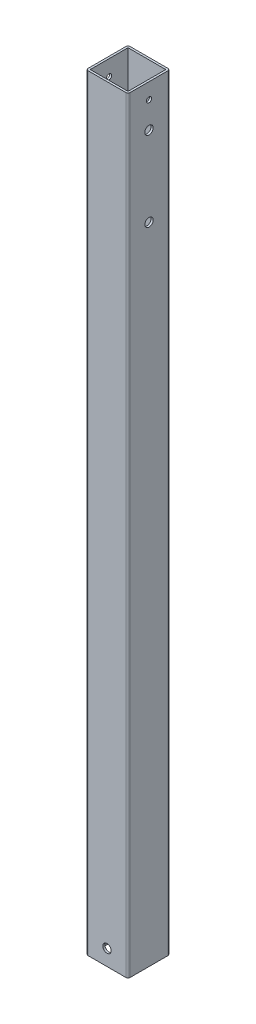
ISO-10303-21;
HEADER;
FILE_DESCRIPTION(('STEP AP214'),'2;1');
FILE_NAME('part.step','',(''),(''),'','','');
FILE_SCHEMA(('AUTOMOTIVE_DESIGN { 1 0 10303 214 1 1 1 1 }'));
ENDSEC;
DATA;
#1=APPLICATION_CONTEXT('core data for automotive mechanical design processes');
#2=APPLICATION_PROTOCOL_DEFINITION('international standard','automotive_design',2000,#1);
#3=PRODUCT_CONTEXT('',#1,'mechanical');
#4=PRODUCT('Part','Part','',(#3));
#5=PRODUCT_RELATED_PRODUCT_CATEGORY('part','',(#4));
#6=PRODUCT_DEFINITION_FORMATION('','',#4);
#7=PRODUCT_DEFINITION_CONTEXT('part definition',#1,'design');
#8=PRODUCT_DEFINITION('design','',#6,#7);
#9=PRODUCT_DEFINITION_SHAPE('','',#8);
#10=(LENGTH_UNIT() NAMED_UNIT(*) SI_UNIT(.MILLI.,.METRE.));
#11=(NAMED_UNIT(*) PLANE_ANGLE_UNIT() SI_UNIT($,.RADIAN.));
#12=(NAMED_UNIT(*) SI_UNIT($,.STERADIAN.) SOLID_ANGLE_UNIT());
#13=UNCERTAINTY_MEASURE_WITH_UNIT(LENGTH_MEASURE(1.E-05),#10,'distance_accuracy_value','');
#14=(GEOMETRIC_REPRESENTATION_CONTEXT(3) GLOBAL_UNCERTAINTY_ASSIGNED_CONTEXT((#13)) GLOBAL_UNIT_ASSIGNED_CONTEXT((#10,
#11,#12)) REPRESENTATION_CONTEXT('',''));
#15=CARTESIAN_POINT('',(0.,0.,0.));
#16=DIRECTION('',(0.,0.,1.));
#17=DIRECTION('',(1.,0.,0.));
#18=AXIS2_PLACEMENT_3D('',#15,#16,#17);
#19=CARTESIAN_POINT('',(38.,730.,2.));
#20=DIRECTION('',(0.,1.,0.));
#21=DIRECTION('',(0.,0.,1.));
#22=AXIS2_PLACEMENT_3D('',#19,#20,#21);
#23=PLANE('',#22);
#24=CARTESIAN_POINT('',(38.,730.,2.));
#25=DIRECTION('',(0.,1.,0.));
#26=DIRECTION('',(0.,0.,-1.));
#27=AXIS2_PLACEMENT_3D('',#24,#25,#26);
#28=CIRCLE('',#27,2.);
#29=CARTESIAN_POINT('',(40.,730.,2.00000000000001));
#30=VERTEX_POINT('',#29);
#31=CARTESIAN_POINT('',(38.,730.,0.));
#32=VERTEX_POINT('',#31);
#33=EDGE_CURVE('E198',#30,#32,#28,.T.);
#34=ORIENTED_EDGE('',*,*,#33,.T.);
#35=DIRECTION('',(-1.,0.,0.));
#36=VECTOR('',#35,1.);
#37=CARTESIAN_POINT('',(2.00000000000001,730.,0.));
#38=LINE('',#37,#36);
#39=CARTESIAN_POINT('',(2.00000000000001,730.,0.));
#40=VERTEX_POINT('',#39);
#41=EDGE_CURVE('E201',#32,#40,#38,.T.);
#42=ORIENTED_EDGE('',*,*,#41,.T.);
#43=CARTESIAN_POINT('',(2.,730.,2.));
#44=DIRECTION('',(0.,1.,0.));
#45=DIRECTION('',(0.,0.,1.));
#46=AXIS2_PLACEMENT_3D('',#43,#44,#45);
#47=CIRCLE('',#46,2.);
#48=CARTESIAN_POINT('',(0.,730.,2.00000000000001));
#49=VERTEX_POINT('',#48);
#50=EDGE_CURVE('E204',#40,#49,#47,.T.);
#51=ORIENTED_EDGE('',*,*,#50,.T.);
#52=DIRECTION('',(0.,0.,1.));
#53=VECTOR('',#52,1.);
#54=CARTESIAN_POINT('',(0.,730.,2.00000000000001));
#55=LINE('',#54,#53);
#56=CARTESIAN_POINT('',(0.,730.,38.));
#57=VERTEX_POINT('',#56);
#58=EDGE_CURVE('E206',#49,#57,#55,.T.);
#59=ORIENTED_EDGE('',*,*,#58,.T.);
#60=CARTESIAN_POINT('',(2.,730.,38.));
#61=DIRECTION('',(0.,1.,0.));
#62=DIRECTION('',(0.,0.,1.));
#63=AXIS2_PLACEMENT_3D('',#60,#61,#62);
#64=CIRCLE('',#63,2.);
#65=CARTESIAN_POINT('',(2.,730.,40.));
#66=VERTEX_POINT('',#65);
#67=EDGE_CURVE('E208',#57,#66,#64,.T.);
#68=ORIENTED_EDGE('',*,*,#67,.T.);
#69=DIRECTION('',(1.,0.,0.));
#70=VECTOR('',#69,1.);
#71=CARTESIAN_POINT('',(2.00000000000002,730.,40.));
#72=LINE('',#71,#70);
#73=CARTESIAN_POINT('',(38.,730.,40.));
#74=VERTEX_POINT('',#73);
#75=EDGE_CURVE('E210',#66,#74,#72,.T.);
#76=ORIENTED_EDGE('',*,*,#75,.T.);
#77=CARTESIAN_POINT('',(38.,730.,38.));
#78=DIRECTION('',(0.,1.,0.));
#79=DIRECTION('',(0.,0.,1.));
#80=AXIS2_PLACEMENT_3D('',#77,#78,#79);
#81=CIRCLE('',#80,2.);
#82=CARTESIAN_POINT('',(40.,730.,38.));
#83=VERTEX_POINT('',#82);
#84=EDGE_CURVE('E212',#74,#83,#81,.T.);
#85=ORIENTED_EDGE('',*,*,#84,.T.);
#86=DIRECTION('',(0.,0.,-1.));
#87=VECTOR('',#86,1.);
#88=CARTESIAN_POINT('',(40.,730.,2.00000000000001));
#89=LINE('',#88,#87);
#90=EDGE_CURVE('E214',#83,#30,#89,.T.);
#91=ORIENTED_EDGE('',*,*,#90,.T.);
#92=EDGE_LOOP('',(#34,#42,#51,#59,#68,#76,#85,#91));
#93=FACE_BOUND('',#92,.T.);
#94=DIRECTION('',(-1.,0.,0.));
#95=VECTOR('',#94,1.);
#96=CARTESIAN_POINT('',(38.,730.,2.));
#97=LINE('',#96,#95);
#98=CARTESIAN_POINT('',(38.,730.,2.));
#99=VERTEX_POINT('',#98);
#100=CARTESIAN_POINT('',(2.,730.,2.));
#101=VERTEX_POINT('',#100);
#102=EDGE_CURVE('E168',#99,#101,#97,.T.);
#103=ORIENTED_EDGE('',*,*,#102,.F.);
#104=DIRECTION('',(0.,0.,-1.));
#105=VECTOR('',#104,1.);
#106=CARTESIAN_POINT('',(38.,730.,2.));
#107=LINE('',#106,#105);
#108=CARTESIAN_POINT('',(38.,730.,38.));
#109=VERTEX_POINT('',#108);
#110=EDGE_CURVE('E160',#109,#99,#107,.T.);
#111=ORIENTED_EDGE('',*,*,#110,.F.);
#112=DIRECTION('',(1.,0.,0.));
#113=VECTOR('',#112,1.);
#114=CARTESIAN_POINT('',(38.,730.,38.));
#115=LINE('',#114,#113);
#116=CARTESIAN_POINT('',(2.00000000000001,730.,38.));
#117=VERTEX_POINT('',#116);
#118=EDGE_CURVE('E182',#117,#109,#115,.T.);
#119=ORIENTED_EDGE('',*,*,#118,.F.);
#120=DIRECTION('',(0.,0.,1.));
#121=VECTOR('',#120,1.);
#122=CARTESIAN_POINT('',(2.,730.,2.));
#123=LINE('',#122,#121);
#124=EDGE_CURVE('E180',#101,#117,#123,.T.);
#125=ORIENTED_EDGE('',*,*,#124,.F.);
#126=EDGE_LOOP('',(#103,#111,#119,#125));
#127=FACE_BOUND('',#126,.T.);
#128=ADVANCED_FACE('F69',(#93,#127),#23,.T.);
#129=CARTESIAN_POINT('',(38.,0.,2.));
#130=DIRECTION('',(0.,1.,0.));
#131=DIRECTION('',(0.,0.,1.));
#132=AXIS2_PLACEMENT_3D('',#129,#130,#131);
#133=PLANE('',#132);
#134=CARTESIAN_POINT('',(38.,0.,2.));
#135=DIRECTION('',(0.,1.,0.));
#136=DIRECTION('',(0.,0.,-1.));
#137=AXIS2_PLACEMENT_3D('',#134,#135,#136);
#138=CIRCLE('',#137,2.);
#139=CARTESIAN_POINT('',(40.,0.,2.00000000000001));
#140=VERTEX_POINT('',#139);
#141=CARTESIAN_POINT('',(38.,0.,0.));
#142=VERTEX_POINT('',#141);
#143=EDGE_CURVE('E176',#140,#142,#138,.T.);
#144=ORIENTED_EDGE('',*,*,#143,.F.);
#145=DIRECTION('',(0.,0.,-1.));
#146=VECTOR('',#145,1.);
#147=CARTESIAN_POINT('',(40.,0.,2.00000000000001));
#148=LINE('',#147,#146);
#149=CARTESIAN_POINT('',(40.,0.,38.));
#150=VERTEX_POINT('',#149);
#151=EDGE_CURVE('E202',#150,#140,#148,.T.);
#152=ORIENTED_EDGE('',*,*,#151,.F.);
#153=CARTESIAN_POINT('',(38.,0.,38.));
#154=DIRECTION('',(0.,1.,0.));
#155=DIRECTION('',(0.,0.,1.));
#156=AXIS2_PLACEMENT_3D('',#153,#154,#155);
#157=CIRCLE('',#156,2.);
#158=CARTESIAN_POINT('',(38.,0.,40.));
#159=VERTEX_POINT('',#158);
#160=EDGE_CURVE('E229',#159,#150,#157,.T.);
#161=ORIENTED_EDGE('',*,*,#160,.F.);
#162=DIRECTION('',(1.,0.,0.));
#163=VECTOR('',#162,1.);
#164=CARTESIAN_POINT('',(2.00000000000002,0.,40.));
#165=LINE('',#164,#163);
#166=CARTESIAN_POINT('',(2.,0.,40.));
#167=VERTEX_POINT('',#166);
#168=EDGE_CURVE('E227',#167,#159,#165,.T.);
#169=ORIENTED_EDGE('',*,*,#168,.F.);
#170=CARTESIAN_POINT('',(2.,0.,38.));
#171=DIRECTION('',(0.,1.,0.));
#172=DIRECTION('',(0.,0.,1.));
#173=AXIS2_PLACEMENT_3D('',#170,#171,#172);
#174=CIRCLE('',#173,2.);
#175=CARTESIAN_POINT('',(0.,0.,38.));
#176=VERTEX_POINT('',#175);
#177=EDGE_CURVE('E225',#176,#167,#174,.T.);
#178=ORIENTED_EDGE('',*,*,#177,.F.);
#179=DIRECTION('',(0.,0.,1.));
#180=VECTOR('',#179,1.);
#181=CARTESIAN_POINT('',(0.,0.,2.00000000000001));
#182=LINE('',#181,#180);
#183=CARTESIAN_POINT('',(0.,0.,2.00000000000001));
#184=VERTEX_POINT('',#183);
#185=EDGE_CURVE('E223',#184,#176,#182,.T.);
#186=ORIENTED_EDGE('',*,*,#185,.F.);
#187=CARTESIAN_POINT('',(2.,0.,2.));
#188=DIRECTION('',(0.,1.,0.));
#189=DIRECTION('',(0.,0.,1.));
#190=AXIS2_PLACEMENT_3D('',#187,#188,#189);
#191=CIRCLE('',#190,2.);
#192=CARTESIAN_POINT('',(2.00000000000001,0.,0.));
#193=VERTEX_POINT('',#192);
#194=EDGE_CURVE('E221',#193,#184,#191,.T.);
#195=ORIENTED_EDGE('',*,*,#194,.F.);
#196=DIRECTION('',(-1.,0.,0.));
#197=VECTOR('',#196,1.);
#198=CARTESIAN_POINT('',(2.00000000000001,0.,0.));
#199=LINE('',#198,#197);
#200=EDGE_CURVE('E219',#142,#193,#199,.T.);
#201=ORIENTED_EDGE('',*,*,#200,.F.);
#202=EDGE_LOOP('',(#144,#152,#161,#169,#178,#186,#195,#201));
#203=FACE_BOUND('',#202,.T.);
#204=DIRECTION('',(0.,0.,-1.));
#205=VECTOR('',#204,1.);
#206=CARTESIAN_POINT('',(38.,0.,2.));
#207=LINE('',#206,#205);
#208=CARTESIAN_POINT('',(38.,0.,38.));
#209=VERTEX_POINT('',#208);
#210=CARTESIAN_POINT('',(38.,0.,2.));
#211=VERTEX_POINT('',#210);
#212=EDGE_CURVE('E94',#209,#211,#207,.T.);
#213=ORIENTED_EDGE('',*,*,#212,.T.);
#214=DIRECTION('',(-1.,0.,0.));
#215=VECTOR('',#214,1.);
#216=CARTESIAN_POINT('',(38.,0.,2.));
#217=LINE('',#216,#215);
#218=CARTESIAN_POINT('',(2.,0.,2.));
#219=VERTEX_POINT('',#218);
#220=EDGE_CURVE('E175',#211,#219,#217,.T.);
#221=ORIENTED_EDGE('',*,*,#220,.T.);
#222=DIRECTION('',(0.,0.,1.));
#223=VECTOR('',#222,1.);
#224=CARTESIAN_POINT('',(2.,0.,2.));
#225=LINE('',#224,#223);
#226=CARTESIAN_POINT('',(2.,0.,38.));
#227=VERTEX_POINT('',#226);
#228=EDGE_CURVE('E190',#219,#227,#225,.T.);
#229=ORIENTED_EDGE('',*,*,#228,.T.);
#230=DIRECTION('',(1.,0.,0.));
#231=VECTOR('',#230,1.);
#232=CARTESIAN_POINT('',(38.,0.,38.));
#233=LINE('',#232,#231);
#234=EDGE_CURVE('E169',#227,#209,#233,.T.);
#235=ORIENTED_EDGE('',*,*,#234,.T.);
#236=EDGE_LOOP('',(#213,#221,#229,#235));
#237=FACE_BOUND('',#236,.T.);
#238=ADVANCED_FACE('F311',(#203,#237),#133,.F.);
#239=CARTESIAN_POINT('',(38.,730.,2.));
#240=DIRECTION('',(0.,-1.,0.));
#241=DIRECTION('',(0.,0.,-1.));
#242=AXIS2_PLACEMENT_3D('',#239,#240,#241);
#243=CYLINDRICAL_SURFACE('',#242,2.);
#244=ORIENTED_EDGE('',*,*,#143,.T.);
#245=DIRECTION('',(0.,-1.,0.));
#246=VECTOR('',#245,1.);
#247=CARTESIAN_POINT('',(38.,730.,0.));
#248=LINE('',#247,#246);
#249=EDGE_CURVE('E12',#32,#142,#248,.T.);
#250=ORIENTED_EDGE('',*,*,#249,.F.);
#251=ORIENTED_EDGE('',*,*,#33,.F.);
#252=DIRECTION('',(0.,-1.,0.));
#253=VECTOR('',#252,1.);
#254=CARTESIAN_POINT('',(40.,730.,2.00000000000001));
#255=LINE('',#254,#253);
#256=EDGE_CURVE('E216',#30,#140,#255,.T.);
#257=ORIENTED_EDGE('',*,*,#256,.T.);
#258=EDGE_LOOP('',(#244,#250,#251,#257));
#259=FACE_BOUND('',#258,.T.);
#260=ADVANCED_FACE('F71',(#259),#243,.T.);
#261=CARTESIAN_POINT('',(2.00000000000001,730.,0.));
#262=DIRECTION('',(0.,0.,1.));
#263=DIRECTION('',(1.,0.,0.));
#264=AXIS2_PLACEMENT_3D('',#261,#262,#263);
#265=PLANE('',#264);
#266=CARTESIAN_POINT('',(20.0000000000001,15.,0.));
#267=DIRECTION('',(0.,0.,1.));
#268=DIRECTION('',(1.,0.,0.));
#269=AXIS2_PLACEMENT_3D('',#266,#267,#268);
#270=CIRCLE('',#269,4.);
#271=CARTESIAN_POINT('',(24.0000000000001,15.,0.));
#272=VERTEX_POINT('',#271);
#273=EDGE_CURVE('E255',#272,#272,#270,.F.);
#274=ORIENTED_EDGE('',*,*,#273,.F.);
#275=EDGE_LOOP('',(#274));
#276=FACE_BOUND('',#275,.T.);
#277=ORIENTED_EDGE('',*,*,#200,.T.);
#278=DIRECTION('',(0.,-1.,0.));
#279=VECTOR('',#278,1.);
#280=CARTESIAN_POINT('',(2.00000000000001,730.,0.));
#281=LINE('',#280,#279);
#282=EDGE_CURVE('E78',#40,#193,#281,.T.);
#283=ORIENTED_EDGE('',*,*,#282,.F.);
#284=ORIENTED_EDGE('',*,*,#41,.F.);
#285=ORIENTED_EDGE('',*,*,#249,.T.);
#286=EDGE_LOOP('',(#277,#283,#284,#285));
#287=FACE_BOUND('',#286,.T.);
#288=ADVANCED_FACE('F342',(#276,#287),#265,.F.);
#289=CARTESIAN_POINT('',(2.,730.,2.));
#290=DIRECTION('',(0.,-1.,0.));
#291=DIRECTION('',(0.,0.,-1.));
#292=AXIS2_PLACEMENT_3D('',#289,#290,#291);
#293=CYLINDRICAL_SURFACE('',#292,2.);
#294=ORIENTED_EDGE('',*,*,#194,.T.);
#295=DIRECTION('',(0.,-1.,0.));
#296=VECTOR('',#295,1.);
#297=CARTESIAN_POINT('',(0.,730.,2.00000000000001));
#298=LINE('',#297,#296);
#299=EDGE_CURVE('E246',#49,#184,#298,.T.);
#300=ORIENTED_EDGE('',*,*,#299,.F.);
#301=ORIENTED_EDGE('',*,*,#50,.F.);
#302=ORIENTED_EDGE('',*,*,#282,.T.);
#303=EDGE_LOOP('',(#294,#300,#301,#302));
#304=FACE_BOUND('',#303,.T.);
#305=ADVANCED_FACE('F339',(#304),#293,.T.);
#306=CARTESIAN_POINT('',(0.,730.,2.00000000000001));
#307=DIRECTION('',(1.,0.,0.));
#308=DIRECTION('',(0.,0.,-1.));
#309=AXIS2_PLACEMENT_3D('',#306,#307,#308);
#310=PLANE('',#309);
#311=CARTESIAN_POINT('',(0.,690.,20.));
#312=DIRECTION('',(1.,0.,0.));
#313=DIRECTION('',(0.,0.,-1.));
#314=AXIS2_PLACEMENT_3D('',#311,#312,#313);
#315=CIRCLE('',#314,4.);
#316=CARTESIAN_POINT('',(0.,690.,16.));
#317=VERTEX_POINT('',#316);
#318=EDGE_CURVE('E419',#317,#317,#315,.F.);
#319=ORIENTED_EDGE('',*,*,#318,.F.);
#320=EDGE_LOOP('',(#319));
#321=FACE_BOUND('',#320,.T.);
#322=CARTESIAN_POINT('',(0.,614.,20.));
#323=DIRECTION('',(1.,0.,0.));
#324=DIRECTION('',(0.,0.,-1.));
#325=AXIS2_PLACEMENT_3D('',#322,#323,#324);
#326=CIRCLE('',#325,4.);
#327=CARTESIAN_POINT('',(0.,614.,16.));
#328=VERTEX_POINT('',#327);
#329=EDGE_CURVE('E263',#328,#328,#326,.F.);
#330=ORIENTED_EDGE('',*,*,#329,.F.);
#331=EDGE_LOOP('',(#330));
#332=FACE_BOUND('',#331,.T.);
#333=CARTESIAN_POINT('',(0.,715.,20.));
#334=DIRECTION('',(-1.,0.,0.));
#335=DIRECTION('',(0.,0.,1.));
#336=AXIS2_PLACEMENT_3D('',#333,#334,#335);
#337=CIRCLE('',#336,2.5);
#338=CARTESIAN_POINT('',(0.,715.,22.5));
#339=VERTEX_POINT('',#338);
#340=EDGE_CURVE('E267',#339,#339,#337,.T.);
#341=ORIENTED_EDGE('',*,*,#340,.F.);
#342=EDGE_LOOP('',(#341));
#343=FACE_BOUND('',#342,.T.);
#344=ORIENTED_EDGE('',*,*,#185,.T.);
#345=DIRECTION('',(0.,-1.,0.));
#346=VECTOR('',#345,1.);
#347=CARTESIAN_POINT('',(0.,730.,38.));
#348=LINE('',#347,#346);
#349=EDGE_CURVE('E243',#57,#176,#348,.T.);
#350=ORIENTED_EDGE('',*,*,#349,.F.);
#351=ORIENTED_EDGE('',*,*,#58,.F.);
#352=ORIENTED_EDGE('',*,*,#299,.T.);
#353=EDGE_LOOP('',(#344,#350,#351,#352));
#354=FACE_BOUND('',#353,.T.);
#355=ADVANCED_FACE('F335',(#321,#332,#343,#354),#310,.F.);
#356=CARTESIAN_POINT('',(2.,730.,38.));
#357=DIRECTION('',(0.,-1.,0.));
#358=DIRECTION('',(0.,0.,-1.));
#359=AXIS2_PLACEMENT_3D('',#356,#357,#358);
#360=CYLINDRICAL_SURFACE('',#359,2.);
#361=ORIENTED_EDGE('',*,*,#177,.T.);
#362=DIRECTION('',(0.,-1.,0.));
#363=VECTOR('',#362,1.);
#364=CARTESIAN_POINT('',(2.,730.,40.));
#365=LINE('',#364,#363);
#366=EDGE_CURVE('E240',#66,#167,#365,.T.);
#367=ORIENTED_EDGE('',*,*,#366,.F.);
#368=ORIENTED_EDGE('',*,*,#67,.F.);
#369=ORIENTED_EDGE('',*,*,#349,.T.);
#370=EDGE_LOOP('',(#361,#367,#368,#369));
#371=FACE_BOUND('',#370,.T.);
#372=ADVANCED_FACE('F332',(#371),#360,.T.);
#373=CARTESIAN_POINT('',(2.00000000000002,730.,40.));
#374=DIRECTION('',(0.,0.,-1.));
#375=DIRECTION('',(-1.,0.,0.));
#376=AXIS2_PLACEMENT_3D('',#373,#374,#375);
#377=PLANE('',#376);
#378=CARTESIAN_POINT('',(20.0000000000001,15.,40.));
#379=DIRECTION('',(0.,0.,-1.));
#380=DIRECTION('',(-1.,0.,0.));
#381=AXIS2_PLACEMENT_3D('',#378,#379,#380);
#382=CIRCLE('',#381,4.);
#383=CARTESIAN_POINT('',(24.0000000000001,15.,40.));
#384=VERTEX_POINT('',#383);
#385=EDGE_CURVE('E188',#384,#384,#382,.T.);
#386=ORIENTED_EDGE('',*,*,#385,.T.);
#387=EDGE_LOOP('',(#386));
#388=FACE_BOUND('',#387,.T.);
#389=ORIENTED_EDGE('',*,*,#168,.T.);
#390=DIRECTION('',(0.,-1.,0.));
#391=VECTOR('',#390,1.);
#392=CARTESIAN_POINT('',(38.,730.,40.));
#393=LINE('',#392,#391);
#394=EDGE_CURVE('E237',#74,#159,#393,.T.);
#395=ORIENTED_EDGE('',*,*,#394,.F.);
#396=ORIENTED_EDGE('',*,*,#75,.F.);
#397=ORIENTED_EDGE('',*,*,#366,.T.);
#398=EDGE_LOOP('',(#389,#395,#396,#397));
#399=FACE_BOUND('',#398,.T.);
#400=ADVANCED_FACE('F291',(#388,#399),#377,.F.);
#401=CARTESIAN_POINT('',(38.,730.,38.));
#402=DIRECTION('',(0.,-1.,0.));
#403=DIRECTION('',(0.,0.,-1.));
#404=AXIS2_PLACEMENT_3D('',#401,#402,#403);
#405=CYLINDRICAL_SURFACE('',#404,2.);
#406=ORIENTED_EDGE('',*,*,#160,.T.);
#407=DIRECTION('',(0.,-1.,0.));
#408=VECTOR('',#407,1.);
#409=CARTESIAN_POINT('',(40.,730.,38.));
#410=LINE('',#409,#408);
#411=EDGE_CURVE('E234',#83,#150,#410,.T.);
#412=ORIENTED_EDGE('',*,*,#411,.F.);
#413=ORIENTED_EDGE('',*,*,#84,.F.);
#414=ORIENTED_EDGE('',*,*,#394,.T.);
#415=EDGE_LOOP('',(#406,#412,#413,#414));
#416=FACE_BOUND('',#415,.T.);
#417=ADVANCED_FACE('F325',(#416),#405,.T.);
#418=CARTESIAN_POINT('',(40.,730.,2.00000000000001));
#419=DIRECTION('',(-1.,0.,0.));
#420=DIRECTION('',(0.,0.,1.));
#421=AXIS2_PLACEMENT_3D('',#418,#419,#420);
#422=PLANE('',#421);
#423=CARTESIAN_POINT('',(40.,690.,20.));
#424=DIRECTION('',(1.,0.,0.));
#425=DIRECTION('',(0.,0.,-1.));
#426=AXIS2_PLACEMENT_3D('',#423,#424,#425);
#427=CIRCLE('',#426,4.);
#428=CARTESIAN_POINT('',(40.,690.,16.));
#429=VERTEX_POINT('',#428);
#430=EDGE_CURVE('E420',#429,#429,#427,.T.);
#431=ORIENTED_EDGE('',*,*,#430,.F.);
#432=EDGE_LOOP('',(#431));
#433=FACE_BOUND('',#432,.T.);
#434=CARTESIAN_POINT('',(40.,614.,20.));
#435=DIRECTION('',(1.,0.,0.));
#436=DIRECTION('',(0.,0.,-1.));
#437=AXIS2_PLACEMENT_3D('',#434,#435,#436);
#438=CIRCLE('',#437,4.);
#439=CARTESIAN_POINT('',(40.,614.,16.));
#440=VERTEX_POINT('',#439);
#441=EDGE_CURVE('E270',#440,#440,#438,.T.);
#442=ORIENTED_EDGE('',*,*,#441,.F.);
#443=EDGE_LOOP('',(#442));
#444=FACE_BOUND('',#443,.T.);
#445=CARTESIAN_POINT('',(40.,715.,20.));
#446=DIRECTION('',(-1.,0.,0.));
#447=DIRECTION('',(0.,0.,1.));
#448=AXIS2_PLACEMENT_3D('',#445,#446,#447);
#449=CIRCLE('',#448,2.5);
#450=CARTESIAN_POINT('',(40.,715.,22.5));
#451=VERTEX_POINT('',#450);
#452=EDGE_CURVE('E259',#451,#451,#449,.F.);
#453=ORIENTED_EDGE('',*,*,#452,.F.);
#454=EDGE_LOOP('',(#453));
#455=FACE_BOUND('',#454,.T.);
#456=ORIENTED_EDGE('',*,*,#151,.T.);
#457=ORIENTED_EDGE('',*,*,#256,.F.);
#458=ORIENTED_EDGE('',*,*,#90,.F.);
#459=ORIENTED_EDGE('',*,*,#411,.T.);
#460=EDGE_LOOP('',(#456,#457,#458,#459));
#461=FACE_BOUND('',#460,.T.);
#462=ADVANCED_FACE('F322',(#433,#444,#455,#461),#422,.F.);
#463=CARTESIAN_POINT('',(38.,730.,2.));
#464=DIRECTION('',(-1.,0.,0.));
#465=DIRECTION('',(0.,0.,1.));
#466=AXIS2_PLACEMENT_3D('',#463,#464,#465);
#467=PLANE('',#466);
#468=CARTESIAN_POINT('',(38.,690.,20.));
#469=DIRECTION('',(-1.,0.,0.));
#470=DIRECTION('',(0.,0.,1.));
#471=AXIS2_PLACEMENT_3D('',#468,#469,#470);
#472=CIRCLE('',#471,4.);
#473=CARTESIAN_POINT('',(38.,690.,24.));
#474=VERTEX_POINT('',#473);
#475=EDGE_CURVE('E275',#474,#474,#472,.T.);
#476=ORIENTED_EDGE('',*,*,#475,.F.);
#477=EDGE_LOOP('',(#476));
#478=FACE_BOUND('',#477,.T.);
#479=CARTESIAN_POINT('',(38.,614.,20.));
#480=DIRECTION('',(-1.,0.,0.));
#481=DIRECTION('',(0.,0.,1.));
#482=AXIS2_PLACEMENT_3D('',#479,#480,#481);
#483=CIRCLE('',#482,4.);
#484=CARTESIAN_POINT('',(38.,614.,24.));
#485=VERTEX_POINT('',#484);
#486=EDGE_CURVE('E262',#485,#485,#483,.T.);
#487=ORIENTED_EDGE('',*,*,#486,.F.);
#488=EDGE_LOOP('',(#487));
#489=FACE_BOUND('',#488,.T.);
#490=CARTESIAN_POINT('',(38.,715.,20.));
#491=DIRECTION('',(-1.,0.,0.));
#492=DIRECTION('',(0.,0.,1.));
#493=AXIS2_PLACEMENT_3D('',#490,#491,#492);
#494=CIRCLE('',#493,2.5);
#495=CARTESIAN_POINT('',(38.,715.,22.5));
#496=VERTEX_POINT('',#495);
#497=EDGE_CURVE('E258',#496,#496,#494,.T.);
#498=ORIENTED_EDGE('',*,*,#497,.F.);
#499=EDGE_LOOP('',(#498));
#500=FACE_BOUND('',#499,.T.);
#501=ORIENTED_EDGE('',*,*,#212,.F.);
#502=DIRECTION('',(0.,-1.,0.));
#503=VECTOR('',#502,1.);
#504=CARTESIAN_POINT('',(38.,730.,38.));
#505=LINE('',#504,#503);
#506=EDGE_CURVE('E164',#109,#209,#505,.T.);
#507=ORIENTED_EDGE('',*,*,#506,.F.);
#508=ORIENTED_EDGE('',*,*,#110,.T.);
#509=DIRECTION('',(0.,-1.,0.));
#510=VECTOR('',#509,1.);
#511=CARTESIAN_POINT('',(38.,730.,2.));
#512=LINE('',#511,#510);
#513=EDGE_CURVE('E163',#99,#211,#512,.T.);
#514=ORIENTED_EDGE('',*,*,#513,.T.);
#515=EDGE_LOOP('',(#501,#507,#508,#514));
#516=FACE_BOUND('',#515,.T.);
#517=ADVANCED_FACE('F162',(#478,#489,#500,#516),#467,.T.);
#518=CARTESIAN_POINT('',(38.,730.,2.));
#519=DIRECTION('',(0.,0.,1.));
#520=DIRECTION('',(1.,0.,0.));
#521=AXIS2_PLACEMENT_3D('',#518,#519,#520);
#522=PLANE('',#521);
#523=CARTESIAN_POINT('',(20.0000000000001,15.,2.));
#524=DIRECTION('',(0.,0.,1.));
#525=DIRECTION('',(1.,0.,0.));
#526=AXIS2_PLACEMENT_3D('',#523,#524,#525);
#527=CIRCLE('',#526,4.);
#528=CARTESIAN_POINT('',(24.0000000000001,15.,2.));
#529=VERTEX_POINT('',#528);
#530=EDGE_CURVE('E254',#529,#529,#527,.T.);
#531=ORIENTED_EDGE('',*,*,#530,.F.);
#532=EDGE_LOOP('',(#531));
#533=FACE_BOUND('',#532,.T.);
#534=ORIENTED_EDGE('',*,*,#220,.F.);
#535=ORIENTED_EDGE('',*,*,#513,.F.);
#536=ORIENTED_EDGE('',*,*,#102,.T.);
#537=DIRECTION('',(0.,-1.,0.));
#538=VECTOR('',#537,1.);
#539=CARTESIAN_POINT('',(2.,730.,2.));
#540=LINE('',#539,#538);
#541=EDGE_CURVE('E177',#101,#219,#540,.T.);
#542=ORIENTED_EDGE('',*,*,#541,.T.);
#543=EDGE_LOOP('',(#534,#535,#536,#542));
#544=FACE_BOUND('',#543,.T.);
#545=ADVANCED_FACE('F172',(#533,#544),#522,.T.);
#546=CARTESIAN_POINT('',(2.,730.,2.));
#547=DIRECTION('',(1.,0.,0.));
#548=DIRECTION('',(0.,0.,-1.));
#549=AXIS2_PLACEMENT_3D('',#546,#547,#548);
#550=PLANE('',#549);
#551=CARTESIAN_POINT('',(2.,690.,20.));
#552=DIRECTION('',(1.,0.,0.));
#553=DIRECTION('',(0.,0.,-1.));
#554=AXIS2_PLACEMENT_3D('',#551,#552,#553);
#555=CIRCLE('',#554,4.);
#556=CARTESIAN_POINT('',(2.,690.,16.));
#557=VERTEX_POINT('',#556);
#558=EDGE_CURVE('E73',#557,#557,#555,.T.);
#559=ORIENTED_EDGE('',*,*,#558,.F.);
#560=EDGE_LOOP('',(#559));
#561=FACE_BOUND('',#560,.T.);
#562=CARTESIAN_POINT('',(2.,614.,20.));
#563=DIRECTION('',(1.,0.,0.));
#564=DIRECTION('',(0.,0.,-1.));
#565=AXIS2_PLACEMENT_3D('',#562,#563,#564);
#566=CIRCLE('',#565,4.);
#567=CARTESIAN_POINT('',(2.,614.,16.));
#568=VERTEX_POINT('',#567);
#569=EDGE_CURVE('E260',#568,#568,#566,.T.);
#570=ORIENTED_EDGE('',*,*,#569,.F.);
#571=EDGE_LOOP('',(#570));
#572=FACE_BOUND('',#571,.T.);
#573=CARTESIAN_POINT('',(2.,715.,20.));
#574=DIRECTION('',(1.,0.,0.));
#575=DIRECTION('',(0.,0.,-1.));
#576=AXIS2_PLACEMENT_3D('',#573,#574,#575);
#577=CIRCLE('',#576,2.5);
#578=CARTESIAN_POINT('',(2.,715.,17.5));
#579=VERTEX_POINT('',#578);
#580=EDGE_CURVE('E256',#579,#579,#577,.T.);
#581=ORIENTED_EDGE('',*,*,#580,.F.);
#582=EDGE_LOOP('',(#581));
#583=FACE_BOUND('',#582,.T.);
#584=ORIENTED_EDGE('',*,*,#228,.F.);
#585=ORIENTED_EDGE('',*,*,#541,.F.);
#586=ORIENTED_EDGE('',*,*,#124,.T.);
#587=DIRECTION('',(0.,-1.,0.));
#588=VECTOR('',#587,1.);
#589=CARTESIAN_POINT('',(2.,730.,38.));
#590=LINE('',#589,#588);
#591=EDGE_CURVE('E86',#117,#227,#590,.T.);
#592=ORIENTED_EDGE('',*,*,#591,.T.);
#593=EDGE_LOOP('',(#584,#585,#586,#592));
#594=FACE_BOUND('',#593,.T.);
#595=ADVANCED_FACE('F306',(#561,#572,#583,#594),#550,.T.);
#596=CARTESIAN_POINT('',(38.,730.,38.));
#597=DIRECTION('',(0.,0.,-1.));
#598=DIRECTION('',(-1.,0.,0.));
#599=AXIS2_PLACEMENT_3D('',#596,#597,#598);
#600=PLANE('',#599);
#601=CARTESIAN_POINT('',(20.0000000000001,15.,38.));
#602=DIRECTION('',(0.,0.,-1.));
#603=DIRECTION('',(-1.,0.,0.));
#604=AXIS2_PLACEMENT_3D('',#601,#602,#603);
#605=CIRCLE('',#604,4.);
#606=CARTESIAN_POINT('',(24.0000000000001,15.,38.));
#607=VERTEX_POINT('',#606);
#608=EDGE_CURVE('E251',#607,#607,#605,.T.);
#609=ORIENTED_EDGE('',*,*,#608,.F.);
#610=EDGE_LOOP('',(#609));
#611=FACE_BOUND('',#610,.T.);
#612=ORIENTED_EDGE('',*,*,#234,.F.);
#613=ORIENTED_EDGE('',*,*,#591,.F.);
#614=ORIENTED_EDGE('',*,*,#118,.T.);
#615=ORIENTED_EDGE('',*,*,#506,.T.);
#616=EDGE_LOOP('',(#612,#613,#614,#615));
#617=FACE_BOUND('',#616,.T.);
#618=ADVANCED_FACE('F297',(#611,#617),#600,.T.);
#619=CARTESIAN_POINT('',(20.0000000000001,15.,-11.3137084989847));
#620=DIRECTION('',(0.,0.,1.));
#621=DIRECTION('',(1.,0.,0.));
#622=AXIS2_PLACEMENT_3D('',#619,#620,#621);
#623=CYLINDRICAL_SURFACE('',#622,4.);
#624=CARTESIAN_POINT('',(24.0000000000001,15.,38.));
#625=CARTESIAN_POINT('',(24.0000000000001,15.,38.0208333333333));
#626=CARTESIAN_POINT('',(24.0000000000001,15.,38.0416666666667));
#627=CARTESIAN_POINT('',(24.0000000000001,15.,38.0833333333333));
#628=CARTESIAN_POINT('',(24.0000000000001,15.,38.1041666666667));
#629=CARTESIAN_POINT('',(24.0000000000001,15.,38.1458333333333));
#630=CARTESIAN_POINT('',(24.0000000000001,15.,38.1666666666667));
#631=CARTESIAN_POINT('',(24.0000000000001,15.,38.2083333333333));
#632=CARTESIAN_POINT('',(24.0000000000001,15.,38.2291666666667));
#633=CARTESIAN_POINT('',(24.0000000000001,15.,38.2708333333333));
#634=CARTESIAN_POINT('',(24.0000000000001,15.,38.2916666666667));
#635=CARTESIAN_POINT('',(24.0000000000001,15.,38.3333333333333));
#636=CARTESIAN_POINT('',(24.0000000000001,15.,38.3541666666667));
#637=CARTESIAN_POINT('',(24.0000000000001,15.,38.3958333333333));
#638=CARTESIAN_POINT('',(24.0000000000001,15.,38.4166666666667));
#639=CARTESIAN_POINT('',(24.0000000000001,15.,38.4583333333333));
#640=CARTESIAN_POINT('',(24.0000000000001,15.,38.4791666666667));
#641=CARTESIAN_POINT('',(24.0000000000001,15.,38.5208333333333));
#642=CARTESIAN_POINT('',(24.0000000000001,15.,38.5416666666667));
#643=CARTESIAN_POINT('',(24.0000000000001,15.,38.5833333333333));
#644=CARTESIAN_POINT('',(24.0000000000001,15.,38.6041666666667));
#645=CARTESIAN_POINT('',(24.0000000000001,15.,38.6458333333333));
#646=CARTESIAN_POINT('',(24.0000000000001,15.,38.6666666666667));
#647=CARTESIAN_POINT('',(24.0000000000001,15.,38.7083333333333));
#648=CARTESIAN_POINT('',(24.0000000000001,15.,38.7291666666667));
#649=CARTESIAN_POINT('',(24.0000000000001,15.,38.7708333333333));
#650=CARTESIAN_POINT('',(24.0000000000001,15.,38.7916666666667));
#651=CARTESIAN_POINT('',(24.0000000000001,15.,38.8333333333333));
#652=CARTESIAN_POINT('',(24.0000000000001,15.,38.8541666666667));
#653=CARTESIAN_POINT('',(24.0000000000001,15.,38.8958333333333));
#654=CARTESIAN_POINT('',(24.0000000000001,15.,38.9166666666667));
#655=CARTESIAN_POINT('',(24.0000000000001,15.,38.9583333333333));
#656=CARTESIAN_POINT('',(24.0000000000001,15.,38.9791666666667));
#657=CARTESIAN_POINT('',(24.0000000000001,15.,39.0208333333333));
#658=CARTESIAN_POINT('',(24.0000000000001,15.,39.0416666666667));
#659=CARTESIAN_POINT('',(24.0000000000001,15.,39.0833333333333));
#660=CARTESIAN_POINT('',(24.0000000000001,15.,39.1041666666667));
#661=CARTESIAN_POINT('',(24.0000000000001,15.,39.1458333333333));
#662=CARTESIAN_POINT('',(24.0000000000001,15.,39.1666666666667));
#663=CARTESIAN_POINT('',(24.0000000000001,15.,39.2083333333333));
#664=CARTESIAN_POINT('',(24.0000000000001,15.,39.2291666666667));
#665=CARTESIAN_POINT('',(24.0000000000001,15.,39.2708333333333));
#666=CARTESIAN_POINT('',(24.0000000000001,15.,39.2916666666667));
#667=CARTESIAN_POINT('',(24.0000000000001,15.,39.3333333333333));
#668=CARTESIAN_POINT('',(24.0000000000001,15.,39.3541666666667));
#669=CARTESIAN_POINT('',(24.0000000000001,15.,39.3958333333333));
#670=CARTESIAN_POINT('',(24.0000000000001,15.,39.4166666666667));
#671=CARTESIAN_POINT('',(24.0000000000001,15.,39.4583333333333));
#672=CARTESIAN_POINT('',(24.0000000000001,15.,39.4791666666667));
#673=CARTESIAN_POINT('',(24.0000000000001,15.,39.5208333333333));
#674=CARTESIAN_POINT('',(24.0000000000001,15.,39.5416666666667));
#675=CARTESIAN_POINT('',(24.0000000000001,15.,39.5833333333333));
#676=CARTESIAN_POINT('',(24.0000000000001,15.,39.6041666666667));
#677=CARTESIAN_POINT('',(24.0000000000001,15.,39.6458333333333));
#678=CARTESIAN_POINT('',(24.0000000000001,15.,39.6666666666667));
#679=CARTESIAN_POINT('',(24.0000000000001,15.,39.7083333333333));
#680=CARTESIAN_POINT('',(24.0000000000001,15.,39.7291666666667));
#681=CARTESIAN_POINT('',(24.0000000000001,15.,39.7708333333333));
#682=CARTESIAN_POINT('',(24.0000000000001,15.,39.7916666666667));
#683=CARTESIAN_POINT('',(24.0000000000001,15.,39.8333333333333));
#684=CARTESIAN_POINT('',(24.0000000000001,15.,39.8541666666667));
#685=CARTESIAN_POINT('',(24.0000000000001,15.,39.8958333333333));
#686=CARTESIAN_POINT('',(24.0000000000001,15.,39.9166666666667));
#687=CARTESIAN_POINT('',(24.0000000000001,15.,39.9583333333333));
#688=CARTESIAN_POINT('',(24.0000000000001,15.,39.9791666666667));
#689=CARTESIAN_POINT('',(24.0000000000001,15.,40.));
#690=B_SPLINE_CURVE_WITH_KNOTS('',3,(#624,#625,#626,#627,#628,#629,#630,#631,#632,#633,#634,
#635,#636,#637,#638,#639,#640,#641,#642,#643,#644,#645,#646,#647,#648,#649,#650,#651,#652,#653,
#654,#655,#656,#657,#658,#659,#660,#661,#662,#663,#664,#665,#666,#667,#668,#669,#670,#671,#672,
#673,#674,#675,#676,#677,#678,#679,#680,#681,#682,#683,#684,#685,#686,#687,#688,#689),
.UNSPECIFIED.,.F.,.F.,(4,2,2,2,2,2,2,2,2,2,2,2,2,2,2,2,2,2,2,2,2,2,2,2,2,2,2,2,2,2,2,2,4),(0.,
0.0625000000000001,0.125,0.1875,0.25,0.3125,0.375,0.4375,0.5,0.5625,0.625000000000001,
0.687500000000001,0.750000000000001,0.812500000000001,0.875000000000001,0.937500000000001,1.,
1.0625,1.125,1.1875,1.25,1.3125,1.375,1.4375,1.5,1.5625,1.625,1.6875,1.75,1.8125,1.875,1.9375,
2.),.UNSPECIFIED.);
#691=EDGE_CURVE('BSEAM294',#607,#384,#690,.T.);
#692=ORIENTED_EDGE('',*,*,#608,.T.);
#693=ORIENTED_EDGE('',*,*,#385,.F.);
#694=ORIENTED_EDGE('',*,*,#691,.T.);
#695=ORIENTED_EDGE('',*,*,#691,.F.);
#696=EDGE_LOOP('',(#692,#694,#693,#695));
#697=FACE_BOUND('',#696,.T.);
#698=ADVANCED_FACE('F294',(#697),#623,.F.);
#699=CARTESIAN_POINT('',(24.0000000000001,15.,2.));
#700=CARTESIAN_POINT('',(24.0000000000001,15.,1.97916666666667));
#701=CARTESIAN_POINT('',(24.0000000000001,15.,1.95833333333333));
#702=CARTESIAN_POINT('',(24.0000000000001,15.,1.91666666666666));
#703=CARTESIAN_POINT('',(24.0000000000001,15.,1.89583333333333));
#704=CARTESIAN_POINT('',(24.0000000000001,15.,1.85416666666666));
#705=CARTESIAN_POINT('',(24.0000000000001,15.,1.83333333333333));
#706=CARTESIAN_POINT('',(24.0000000000001,15.,1.79166666666666));
#707=CARTESIAN_POINT('',(24.0000000000001,15.,1.77083333333333));
#708=CARTESIAN_POINT('',(24.0000000000001,15.,1.72916666666666));
#709=CARTESIAN_POINT('',(24.0000000000001,15.,1.70833333333333));
#710=CARTESIAN_POINT('',(24.0000000000001,15.,1.66666666666666));
#711=CARTESIAN_POINT('',(24.0000000000001,15.,1.64583333333333));
#712=CARTESIAN_POINT('',(24.0000000000001,15.,1.60416666666666));
#713=CARTESIAN_POINT('',(24.0000000000001,15.,1.58333333333333));
#714=CARTESIAN_POINT('',(24.0000000000001,15.,1.54166666666666));
#715=CARTESIAN_POINT('',(24.0000000000001,15.,1.52083333333333));
#716=CARTESIAN_POINT('',(24.0000000000001,15.,1.47916666666667));
#717=CARTESIAN_POINT('',(24.0000000000001,15.,1.45833333333333));
#718=CARTESIAN_POINT('',(24.0000000000001,15.,1.41666666666667));
#719=CARTESIAN_POINT('',(24.0000000000001,15.,1.39583333333333));
#720=CARTESIAN_POINT('',(24.0000000000001,15.,1.35416666666667));
#721=CARTESIAN_POINT('',(24.0000000000001,15.,1.33333333333333));
#722=CARTESIAN_POINT('',(24.0000000000001,15.,1.29166666666667));
#723=CARTESIAN_POINT('',(24.0000000000001,15.,1.27083333333333));
#724=CARTESIAN_POINT('',(24.0000000000001,15.,1.22916666666667));
#725=CARTESIAN_POINT('',(24.0000000000001,15.,1.20833333333333));
#726=CARTESIAN_POINT('',(24.0000000000001,15.,1.16666666666667));
#727=CARTESIAN_POINT('',(24.0000000000001,15.,1.14583333333333));
#728=CARTESIAN_POINT('',(24.0000000000001,15.,1.10416666666667));
#729=CARTESIAN_POINT('',(24.0000000000001,15.,1.08333333333333));
#730=CARTESIAN_POINT('',(24.0000000000001,15.,1.04166666666667));
#731=CARTESIAN_POINT('',(24.0000000000001,15.,1.02083333333333));
#732=CARTESIAN_POINT('',(24.0000000000001,15.,0.979166666666666));
#733=CARTESIAN_POINT('',(24.0000000000001,15.,0.958333333333332));
#734=CARTESIAN_POINT('',(24.0000000000001,15.,0.916666666666666));
#735=CARTESIAN_POINT('',(24.0000000000001,15.,0.895833333333332));
#736=CARTESIAN_POINT('',(24.0000000000001,15.,0.854166666666666));
#737=CARTESIAN_POINT('',(24.0000000000001,15.,0.833333333333332));
#738=CARTESIAN_POINT('',(24.0000000000001,15.,0.791666666666666));
#739=CARTESIAN_POINT('',(24.0000000000001,15.,0.770833333333332));
#740=CARTESIAN_POINT('',(24.0000000000001,15.,0.729166666666666));
#741=CARTESIAN_POINT('',(24.0000000000001,15.,0.708333333333332));
#742=CARTESIAN_POINT('',(24.0000000000001,15.,0.666666666666666));
#743=CARTESIAN_POINT('',(24.0000000000001,15.,0.645833333333332));
#744=CARTESIAN_POINT('',(24.0000000000001,15.,0.604166666666666));
#745=CARTESIAN_POINT('',(24.0000000000001,15.,0.583333333333333));
#746=CARTESIAN_POINT('',(24.0000000000001,15.,0.541666666666667));
#747=CARTESIAN_POINT('',(24.0000000000001,15.,0.520833333333334));
#748=CARTESIAN_POINT('',(24.0000000000001,15.,0.479166666666667));
#749=CARTESIAN_POINT('',(24.0000000000001,15.,0.458333333333334));
#750=CARTESIAN_POINT('',(24.0000000000001,15.,0.416666666666667));
#751=CARTESIAN_POINT('',(24.0000000000001,15.,0.395833333333334));
#752=CARTESIAN_POINT('',(24.0000000000001,15.,0.354166666666667));
#753=CARTESIAN_POINT('',(24.0000000000001,15.,0.333333333333334));
#754=CARTESIAN_POINT('',(24.0000000000001,15.,0.291666666666667));
#755=CARTESIAN_POINT('',(24.0000000000001,15.,0.270833333333334));
#756=CARTESIAN_POINT('',(24.0000000000001,15.,0.229166666666667));
#757=CARTESIAN_POINT('',(24.0000000000001,15.,0.208333333333334));
#758=CARTESIAN_POINT('',(24.0000000000001,15.,0.166666666666667));
#759=CARTESIAN_POINT('',(24.0000000000001,15.,0.145833333333333));
#760=CARTESIAN_POINT('',(24.0000000000001,15.,0.104166666666667));
#761=CARTESIAN_POINT('',(24.0000000000001,15.,0.0833333333333334));
#762=CARTESIAN_POINT('',(24.0000000000001,15.,0.0416666666666667));
#763=CARTESIAN_POINT('',(24.0000000000001,15.,0.0208333333333333));
#764=CARTESIAN_POINT('',(24.0000000000001,15.,0.));
#765=B_SPLINE_CURVE_WITH_KNOTS('',3,(#699,#700,#701,#702,#703,#704,#705,#706,#707,#708,#709,
#710,#711,#712,#713,#714,#715,#716,#717,#718,#719,#720,#721,#722,#723,#724,#725,#726,#727,#728,
#729,#730,#731,#732,#733,#734,#735,#736,#737,#738,#739,#740,#741,#742,#743,#744,#745,#746,#747,
#748,#749,#750,#751,#752,#753,#754,#755,#756,#757,#758,#759,#760,#761,#762,#763,#764),
.UNSPECIFIED.,.F.,.F.,(4,2,2,2,2,2,2,2,2,2,2,2,2,2,2,2,2,2,2,2,2,2,2,2,2,2,2,2,2,2,2,2,4),(0.,
0.0625000000000001,0.125,0.1875,0.25,0.3125,0.375,0.4375,0.5,0.562499999999999,
0.624999999999999,0.687499999999999,0.749999999999999,0.812499999999999,0.874999999999999,
0.937499999999999,0.999999999999999,1.0625,1.125,1.1875,1.25,1.3125,1.375,1.4375,1.5,1.5625,
1.625,1.6875,1.75,1.8125,1.875,1.9375,2.),.UNSPECIFIED.);
#766=EDGE_CURVE('BSEAM296',#529,#272,#765,.T.);
#767=ORIENTED_EDGE('',*,*,#530,.T.);
#768=ORIENTED_EDGE('',*,*,#273,.T.);
#769=ORIENTED_EDGE('',*,*,#766,.T.);
#770=ORIENTED_EDGE('',*,*,#766,.F.);
#771=EDGE_LOOP('',(#767,#769,#768,#770));
#772=FACE_BOUND('',#771,.T.);
#773=ADVANCED_FACE('F296',(#772),#623,.F.);
#774=CARTESIAN_POINT('',(47.0710678118654,715.,20.));
#775=DIRECTION('',(-1.,0.,0.));
#776=DIRECTION('',(0.,0.,1.));
#777=AXIS2_PLACEMENT_3D('',#774,#775,#776);
#778=CYLINDRICAL_SURFACE('',#777,2.5);
#779=ORIENTED_EDGE('',*,*,#580,.T.);
#780=EDGE_LOOP('',(#779));
#781=FACE_BOUND('',#780,.T.);
#782=ORIENTED_EDGE('',*,*,#340,.T.);
#783=EDGE_LOOP('',(#782));
#784=FACE_BOUND('',#783,.T.);
#785=ADVANCED_FACE('F304',(#781,#784),#778,.F.);
#786=CARTESIAN_POINT('',(38.,715.,22.5));
#787=CARTESIAN_POINT('',(38.0208333333333,715.,22.5));
#788=CARTESIAN_POINT('',(38.0416666666667,715.,22.5));
#789=CARTESIAN_POINT('',(38.0833333333333,715.,22.5));
#790=CARTESIAN_POINT('',(38.1041666666667,715.,22.5));
#791=CARTESIAN_POINT('',(38.1458333333333,715.,22.5));
#792=CARTESIAN_POINT('',(38.1666666666667,715.,22.5));
#793=CARTESIAN_POINT('',(38.2083333333333,715.,22.5));
#794=CARTESIAN_POINT('',(38.2291666666667,715.,22.5));
#795=CARTESIAN_POINT('',(38.2708333333333,715.,22.5));
#796=CARTESIAN_POINT('',(38.2916666666667,715.,22.5));
#797=CARTESIAN_POINT('',(38.3333333333333,715.,22.5));
#798=CARTESIAN_POINT('',(38.3541666666667,715.,22.5));
#799=CARTESIAN_POINT('',(38.3958333333333,715.,22.5));
#800=CARTESIAN_POINT('',(38.4166666666667,715.,22.5));
#801=CARTESIAN_POINT('',(38.4583333333333,715.,22.5));
#802=CARTESIAN_POINT('',(38.4791666666667,715.,22.5));
#803=CARTESIAN_POINT('',(38.5208333333333,715.,22.5));
#804=CARTESIAN_POINT('',(38.5416666666667,715.,22.5));
#805=CARTESIAN_POINT('',(38.5833333333333,715.,22.5));
#806=CARTESIAN_POINT('',(38.6041666666667,715.,22.5));
#807=CARTESIAN_POINT('',(38.6458333333333,715.,22.5));
#808=CARTESIAN_POINT('',(38.6666666666667,715.,22.5));
#809=CARTESIAN_POINT('',(38.7083333333333,715.,22.5));
#810=CARTESIAN_POINT('',(38.7291666666667,715.,22.5));
#811=CARTESIAN_POINT('',(38.7708333333333,715.,22.5));
#812=CARTESIAN_POINT('',(38.7916666666667,715.,22.5));
#813=CARTESIAN_POINT('',(38.8333333333333,715.,22.5));
#814=CARTESIAN_POINT('',(38.8541666666667,715.,22.5));
#815=CARTESIAN_POINT('',(38.8958333333333,715.,22.5));
#816=CARTESIAN_POINT('',(38.9166666666667,715.,22.5));
#817=CARTESIAN_POINT('',(38.9583333333333,715.,22.5));
#818=CARTESIAN_POINT('',(38.9791666666667,715.,22.5));
#819=CARTESIAN_POINT('',(39.0208333333333,715.,22.5));
#820=CARTESIAN_POINT('',(39.0416666666667,715.,22.5));
#821=CARTESIAN_POINT('',(39.0833333333333,715.,22.5));
#822=CARTESIAN_POINT('',(39.1041666666667,715.,22.5));
#823=CARTESIAN_POINT('',(39.1458333333333,715.,22.5));
#824=CARTESIAN_POINT('',(39.1666666666667,715.,22.5));
#825=CARTESIAN_POINT('',(39.2083333333333,715.,22.5));
#826=CARTESIAN_POINT('',(39.2291666666667,715.,22.5));
#827=CARTESIAN_POINT('',(39.2708333333333,715.,22.5));
#828=CARTESIAN_POINT('',(39.2916666666667,715.,22.5));
#829=CARTESIAN_POINT('',(39.3333333333333,715.,22.5));
#830=CARTESIAN_POINT('',(39.3541666666667,715.,22.5));
#831=CARTESIAN_POINT('',(39.3958333333333,715.,22.5));
#832=CARTESIAN_POINT('',(39.4166666666667,715.,22.5));
#833=CARTESIAN_POINT('',(39.4583333333333,715.,22.5));
#834=CARTESIAN_POINT('',(39.4791666666667,715.,22.5));
#835=CARTESIAN_POINT('',(39.5208333333333,715.,22.5));
#836=CARTESIAN_POINT('',(39.5416666666667,715.,22.5));
#837=CARTESIAN_POINT('',(39.5833333333333,715.,22.5));
#838=CARTESIAN_POINT('',(39.6041666666667,715.,22.5));
#839=CARTESIAN_POINT('',(39.6458333333333,715.,22.5));
#840=CARTESIAN_POINT('',(39.6666666666667,715.,22.5));
#841=CARTESIAN_POINT('',(39.7083333333333,715.,22.5));
#842=CARTESIAN_POINT('',(39.7291666666667,715.,22.5));
#843=CARTESIAN_POINT('',(39.7708333333333,715.,22.5));
#844=CARTESIAN_POINT('',(39.7916666666667,715.,22.5));
#845=CARTESIAN_POINT('',(39.8333333333333,715.,22.5));
#846=CARTESIAN_POINT('',(39.8541666666667,715.,22.5));
#847=CARTESIAN_POINT('',(39.8958333333333,715.,22.5));
#848=CARTESIAN_POINT('',(39.9166666666667,715.,22.5));
#849=CARTESIAN_POINT('',(39.9583333333333,715.,22.5));
#850=CARTESIAN_POINT('',(39.9791666666667,715.,22.5));
#851=CARTESIAN_POINT('',(40.,715.,22.5));
#852=B_SPLINE_CURVE_WITH_KNOTS('',3,(#786,#787,#788,#789,#790,#791,#792,#793,#794,#795,#796,
#797,#798,#799,#800,#801,#802,#803,#804,#805,#806,#807,#808,#809,#810,#811,#812,#813,#814,#815,
#816,#817,#818,#819,#820,#821,#822,#823,#824,#825,#826,#827,#828,#829,#830,#831,#832,#833,#834,
#835,#836,#837,#838,#839,#840,#841,#842,#843,#844,#845,#846,#847,#848,#849,#850,#851),
.UNSPECIFIED.,.F.,.F.,(4,2,2,2,2,2,2,2,2,2,2,2,2,2,2,2,2,2,2,2,2,2,2,2,2,2,2,2,2,2,2,2,4),(0.,
0.062500000000007,0.125,0.187500000000007,0.25,0.312500000000007,0.375,0.437500000000007,0.5,
0.562500000000007,0.625000000000001,0.687500000000008,0.750000000000001,0.812500000000008,
0.875000000000001,0.937500000000008,1.,1.06250000000001,1.125,1.18750000000001,1.25,
1.31250000000001,1.375,1.43750000000001,1.5,1.56250000000001,1.625,1.68750000000001,1.75,
1.81250000000001,1.875,1.93750000000001,2.),.UNSPECIFIED.);
#853=EDGE_CURVE('BSEAM394',#496,#451,#852,.T.);
#854=ORIENTED_EDGE('',*,*,#497,.T.);
#855=ORIENTED_EDGE('',*,*,#452,.T.);
#856=ORIENTED_EDGE('',*,*,#853,.T.);
#857=ORIENTED_EDGE('',*,*,#853,.F.);
#858=EDGE_LOOP('',(#854,#856,#855,#857));
#859=FACE_BOUND('',#858,.T.);
#860=ADVANCED_FACE('F394',(#859),#778,.F.);
#861=CARTESIAN_POINT('',(-11.3137084989847,614.,20.));
#862=DIRECTION('',(1.,0.,0.));
#863=DIRECTION('',(0.,0.,-1.));
#864=AXIS2_PLACEMENT_3D('',#861,#862,#863);
#865=CYLINDRICAL_SURFACE('',#864,4.);
#866=CARTESIAN_POINT('',(2.,614.,16.));
#867=CARTESIAN_POINT('',(1.97916666666667,614.,16.));
#868=CARTESIAN_POINT('',(1.95833333333334,614.,16.));
#869=CARTESIAN_POINT('',(1.91666666666667,614.,16.));
#870=CARTESIAN_POINT('',(1.89583333333334,614.,16.));
#871=CARTESIAN_POINT('',(1.85416666666667,614.,16.));
#872=CARTESIAN_POINT('',(1.83333333333334,614.,16.));
#873=CARTESIAN_POINT('',(1.79166666666667,614.,16.));
#874=CARTESIAN_POINT('',(1.77083333333334,614.,16.));
#875=CARTESIAN_POINT('',(1.72916666666667,614.,16.));
#876=CARTESIAN_POINT('',(1.70833333333333,614.,16.));
#877=CARTESIAN_POINT('',(1.66666666666667,614.,16.));
#878=CARTESIAN_POINT('',(1.64583333333333,614.,16.));
#879=CARTESIAN_POINT('',(1.60416666666667,614.,16.));
#880=CARTESIAN_POINT('',(1.58333333333333,614.,16.));
#881=CARTESIAN_POINT('',(1.54166666666667,614.,16.));
#882=CARTESIAN_POINT('',(1.52083333333333,614.,16.));
#883=CARTESIAN_POINT('',(1.47916666666667,614.,16.));
#884=CARTESIAN_POINT('',(1.45833333333333,614.,16.));
#885=CARTESIAN_POINT('',(1.41666666666667,614.,16.));
#886=CARTESIAN_POINT('',(1.39583333333333,614.,16.));
#887=CARTESIAN_POINT('',(1.35416666666667,614.,16.));
#888=CARTESIAN_POINT('',(1.33333333333333,614.,16.));
#889=CARTESIAN_POINT('',(1.29166666666667,614.,16.));
#890=CARTESIAN_POINT('',(1.27083333333333,614.,16.));
#891=CARTESIAN_POINT('',(1.22916666666667,614.,16.));
#892=CARTESIAN_POINT('',(1.20833333333333,614.,16.));
#893=CARTESIAN_POINT('',(1.16666666666667,614.,16.));
#894=CARTESIAN_POINT('',(1.14583333333333,614.,16.));
#895=CARTESIAN_POINT('',(1.10416666666667,614.,16.));
#896=CARTESIAN_POINT('',(1.08333333333333,614.,16.));
#897=CARTESIAN_POINT('',(1.04166666666667,614.,16.));
#898=CARTESIAN_POINT('',(1.02083333333333,614.,16.));
#899=CARTESIAN_POINT('',(0.979166666666668,614.,16.));
#900=CARTESIAN_POINT('',(0.958333333333334,614.,16.));
#901=CARTESIAN_POINT('',(0.916666666666668,614.,16.));
#902=CARTESIAN_POINT('',(0.895833333333334,614.,16.));
#903=CARTESIAN_POINT('',(0.854166666666667,614.,16.));
#904=CARTESIAN_POINT('',(0.833333333333334,614.,16.));
#905=CARTESIAN_POINT('',(0.791666666666667,614.,16.));
#906=CARTESIAN_POINT('',(0.770833333333334,614.,16.));
#907=CARTESIAN_POINT('',(0.729166666666667,614.,16.));
#908=CARTESIAN_POINT('',(0.708333333333334,614.,16.));
#909=CARTESIAN_POINT('',(0.666666666666667,614.,16.));
#910=CARTESIAN_POINT('',(0.645833333333334,614.,16.));
#911=CARTESIAN_POINT('',(0.604166666666667,614.,16.));
#912=CARTESIAN_POINT('',(0.583333333333334,614.,16.));
#913=CARTESIAN_POINT('',(0.541666666666667,614.,16.));
#914=CARTESIAN_POINT('',(0.520833333333334,614.,16.));
#915=CARTESIAN_POINT('',(0.479166666666667,614.,16.));
#916=CARTESIAN_POINT('',(0.458333333333334,614.,16.));
#917=CARTESIAN_POINT('',(0.416666666666667,614.,16.));
#918=CARTESIAN_POINT('',(0.395833333333334,614.,16.));
#919=CARTESIAN_POINT('',(0.354166666666667,614.,16.));
#920=CARTESIAN_POINT('',(0.333333333333334,614.,16.));
#921=CARTESIAN_POINT('',(0.291666666666667,614.,16.));
#922=CARTESIAN_POINT('',(0.270833333333334,614.,16.));
#923=CARTESIAN_POINT('',(0.229166666666667,614.,16.));
#924=CARTESIAN_POINT('',(0.208333333333334,614.,16.));
#925=CARTESIAN_POINT('',(0.166666666666667,614.,16.));
#926=CARTESIAN_POINT('',(0.145833333333333,614.,16.));
#927=CARTESIAN_POINT('',(0.104166666666667,614.,16.));
#928=CARTESIAN_POINT('',(0.0833333333333334,614.,16.));
#929=CARTESIAN_POINT('',(0.0416666666666667,614.,16.));
#930=CARTESIAN_POINT('',(0.0208333333333333,614.,16.));
#931=CARTESIAN_POINT('',(0.,614.,16.));
#932=B_SPLINE_CURVE_WITH_KNOTS('',3,(#866,#867,#868,#869,#870,#871,#872,#873,#874,#875,#876,
#877,#878,#879,#880,#881,#882,#883,#884,#885,#886,#887,#888,#889,#890,#891,#892,#893,#894,#895,
#896,#897,#898,#899,#900,#901,#902,#903,#904,#905,#906,#907,#908,#909,#910,#911,#912,#913,#914,
#915,#916,#917,#918,#919,#920,#921,#922,#923,#924,#925,#926,#927,#928,#929,#930,#931),
.UNSPECIFIED.,.F.,.F.,(4,2,2,2,2,2,2,2,2,2,2,2,2,2,2,2,2,2,2,2,2,2,2,2,2,2,2,2,2,2,2,2,4),(0.,
0.0625000000000001,0.125,0.1875,0.25,0.3125,0.375,0.4375,0.5,0.5625,0.625000000000001,
0.687500000000001,0.750000000000001,0.812500000000001,0.875000000000001,0.937500000000001,1.,
1.0625,1.125,1.1875,1.25,1.3125,1.375,1.4375,1.5,1.5625,1.625,1.6875,1.75,1.8125,1.875,1.9375,
2.),.UNSPECIFIED.);
#933=EDGE_CURVE('BSEAM400',#568,#328,#932,.T.);
#934=ORIENTED_EDGE('',*,*,#569,.T.);
#935=ORIENTED_EDGE('',*,*,#329,.T.);
#936=ORIENTED_EDGE('',*,*,#933,.T.);
#937=ORIENTED_EDGE('',*,*,#933,.F.);
#938=EDGE_LOOP('',(#934,#936,#935,#937));
#939=FACE_BOUND('',#938,.T.);
#940=ADVANCED_FACE('F400',(#939),#865,.F.);
#941=ORIENTED_EDGE('',*,*,#486,.T.);
#942=EDGE_LOOP('',(#941));
#943=FACE_BOUND('',#942,.T.);
#944=ORIENTED_EDGE('',*,*,#441,.T.);
#945=EDGE_LOOP('',(#944));
#946=FACE_BOUND('',#945,.T.);
#947=ADVANCED_FACE('F405',(#943,#946),#865,.F.);
#948=CARTESIAN_POINT('',(-11.3137084989847,690.,20.));
#949=DIRECTION('',(1.,0.,0.));
#950=DIRECTION('',(0.,0.,-1.));
#951=AXIS2_PLACEMENT_3D('',#948,#949,#950);
#952=CYLINDRICAL_SURFACE('',#951,4.);
#953=CARTESIAN_POINT('',(2.,690.,16.));
#954=CARTESIAN_POINT('',(1.97916666666667,690.,16.));
#955=CARTESIAN_POINT('',(1.95833333333334,690.,16.));
#956=CARTESIAN_POINT('',(1.91666666666667,690.,16.));
#957=CARTESIAN_POINT('',(1.89583333333334,690.,16.));
#958=CARTESIAN_POINT('',(1.85416666666667,690.,16.));
#959=CARTESIAN_POINT('',(1.83333333333334,690.,16.));
#960=CARTESIAN_POINT('',(1.79166666666667,690.,16.));
#961=CARTESIAN_POINT('',(1.77083333333334,690.,16.));
#962=CARTESIAN_POINT('',(1.72916666666667,690.,16.));
#963=CARTESIAN_POINT('',(1.70833333333333,690.,16.));
#964=CARTESIAN_POINT('',(1.66666666666667,690.,16.));
#965=CARTESIAN_POINT('',(1.64583333333333,690.,16.));
#966=CARTESIAN_POINT('',(1.60416666666667,690.,16.));
#967=CARTESIAN_POINT('',(1.58333333333333,690.,16.));
#968=CARTESIAN_POINT('',(1.54166666666667,690.,16.));
#969=CARTESIAN_POINT('',(1.52083333333333,690.,16.));
#970=CARTESIAN_POINT('',(1.47916666666667,690.,16.));
#971=CARTESIAN_POINT('',(1.45833333333333,690.,16.));
#972=CARTESIAN_POINT('',(1.41666666666667,690.,16.));
#973=CARTESIAN_POINT('',(1.39583333333333,690.,16.));
#974=CARTESIAN_POINT('',(1.35416666666667,690.,16.));
#975=CARTESIAN_POINT('',(1.33333333333333,690.,16.));
#976=CARTESIAN_POINT('',(1.29166666666667,690.,16.));
#977=CARTESIAN_POINT('',(1.27083333333333,690.,16.));
#978=CARTESIAN_POINT('',(1.22916666666667,690.,16.));
#979=CARTESIAN_POINT('',(1.20833333333333,690.,16.));
#980=CARTESIAN_POINT('',(1.16666666666667,690.,16.));
#981=CARTESIAN_POINT('',(1.14583333333333,690.,16.));
#982=CARTESIAN_POINT('',(1.10416666666667,690.,16.));
#983=CARTESIAN_POINT('',(1.08333333333333,690.,16.));
#984=CARTESIAN_POINT('',(1.04166666666667,690.,16.));
#985=CARTESIAN_POINT('',(1.02083333333333,690.,16.));
#986=CARTESIAN_POINT('',(0.979166666666668,690.,16.));
#987=CARTESIAN_POINT('',(0.958333333333334,690.,16.));
#988=CARTESIAN_POINT('',(0.916666666666668,690.,16.));
#989=CARTESIAN_POINT('',(0.895833333333334,690.,16.));
#990=CARTESIAN_POINT('',(0.854166666666667,690.,16.));
#991=CARTESIAN_POINT('',(0.833333333333334,690.,16.));
#992=CARTESIAN_POINT('',(0.791666666666667,690.,16.));
#993=CARTESIAN_POINT('',(0.770833333333334,690.,16.));
#994=CARTESIAN_POINT('',(0.729166666666667,690.,16.));
#995=CARTESIAN_POINT('',(0.708333333333334,690.,16.));
#996=CARTESIAN_POINT('',(0.666666666666667,690.,16.));
#997=CARTESIAN_POINT('',(0.645833333333334,690.,16.));
#998=CARTESIAN_POINT('',(0.604166666666667,690.,16.));
#999=CARTESIAN_POINT('',(0.583333333333334,690.,16.));
#1000=CARTESIAN_POINT('',(0.541666666666667,690.,16.));
#1001=CARTESIAN_POINT('',(0.520833333333334,690.,16.));
#1002=CARTESIAN_POINT('',(0.479166666666667,690.,16.));
#1003=CARTESIAN_POINT('',(0.458333333333334,690.,16.));
#1004=CARTESIAN_POINT('',(0.416666666666667,690.,16.));
#1005=CARTESIAN_POINT('',(0.395833333333334,690.,16.));
#1006=CARTESIAN_POINT('',(0.354166666666667,690.,16.));
#1007=CARTESIAN_POINT('',(0.333333333333334,690.,16.));
#1008=CARTESIAN_POINT('',(0.291666666666667,690.,16.));
#1009=CARTESIAN_POINT('',(0.270833333333334,690.,16.));
#1010=CARTESIAN_POINT('',(0.229166666666667,690.,16.));
#1011=CARTESIAN_POINT('',(0.208333333333334,690.,16.));
#1012=CARTESIAN_POINT('',(0.166666666666667,690.,16.));
#1013=CARTESIAN_POINT('',(0.145833333333333,690.,16.));
#1014=CARTESIAN_POINT('',(0.104166666666667,690.,16.));
#1015=CARTESIAN_POINT('',(0.0833333333333334,690.,16.));
#1016=CARTESIAN_POINT('',(0.0416666666666667,690.,16.));
#1017=CARTESIAN_POINT('',(0.0208333333333333,690.,16.));
#1018=CARTESIAN_POINT('',(0.,690.,16.));
#1019=B_SPLINE_CURVE_WITH_KNOTS('',3,(#953,#954,#955,#956,#957,#958,#959,#960,#961,#962,#963,
#964,#965,#966,#967,#968,#969,#970,#971,#972,#973,#974,#975,#976,#977,#978,#979,#980,#981,#982,
#983,#984,#985,#986,#987,#988,#989,#990,#991,#992,#993,#994,#995,#996,#997,#998,#999,#1000,
#1001,#1002,#1003,#1004,#1005,#1006,#1007,#1008,#1009,#1010,#1011,#1012,#1013,#1014,#1015,#1016,
#1017,#1018),.UNSPECIFIED.,.F.,.F.,(4,2,2,2,2,2,2,2,2,2,2,2,2,2,2,2,2,2,2,2,2,2,2,2,2,2,2,2,2,2,
2,2,4),(0.,0.0625000000000001,0.125,0.1875,0.25,0.3125,0.375,0.4375,0.5,0.5625,
0.625000000000001,0.687500000000001,0.750000000000001,0.812500000000001,0.875000000000001,
0.937500000000001,1.,1.0625,1.125,1.1875,1.25,1.3125,1.375,1.4375,1.5,1.5625,1.625,1.6875,1.75,
1.8125,1.875,1.9375,2.),.UNSPECIFIED.);
#1020=EDGE_CURVE('BSEAM406',#557,#317,#1019,.T.);
#1021=ORIENTED_EDGE('',*,*,#558,.T.);
#1022=ORIENTED_EDGE('',*,*,#318,.T.);
#1023=ORIENTED_EDGE('',*,*,#1020,.T.);
#1024=ORIENTED_EDGE('',*,*,#1020,.F.);
#1025=EDGE_LOOP('',(#1021,#1023,#1022,#1024));
#1026=FACE_BOUND('',#1025,.T.);
#1027=ADVANCED_FACE('F406',(#1026),#952,.F.);
#1028=ORIENTED_EDGE('',*,*,#475,.T.);
#1029=EDGE_LOOP('',(#1028));
#1030=FACE_BOUND('',#1029,.T.);
#1031=ORIENTED_EDGE('',*,*,#430,.T.);
#1032=EDGE_LOOP('',(#1031));
#1033=FACE_BOUND('',#1032,.T.);
#1034=ADVANCED_FACE('F408',(#1030,#1033),#952,.F.);
#1035=CLOSED_SHELL('',(#128,#238,#260,#288,#305,#355,#372,#400,#417,#462,#517,#545,#595,#618,
#698,#773,#785,#860,#940,#947,#1027,#1034));
#1036=MANIFOLD_SOLID_BREP('B2',#1035);
#1037=ADVANCED_BREP_SHAPE_REPRESENTATION('',(#18,#1036),#14);
#1038=SHAPE_DEFINITION_REPRESENTATION(#9,#1037);
ENDSEC;
END-ISO-10303-21;
